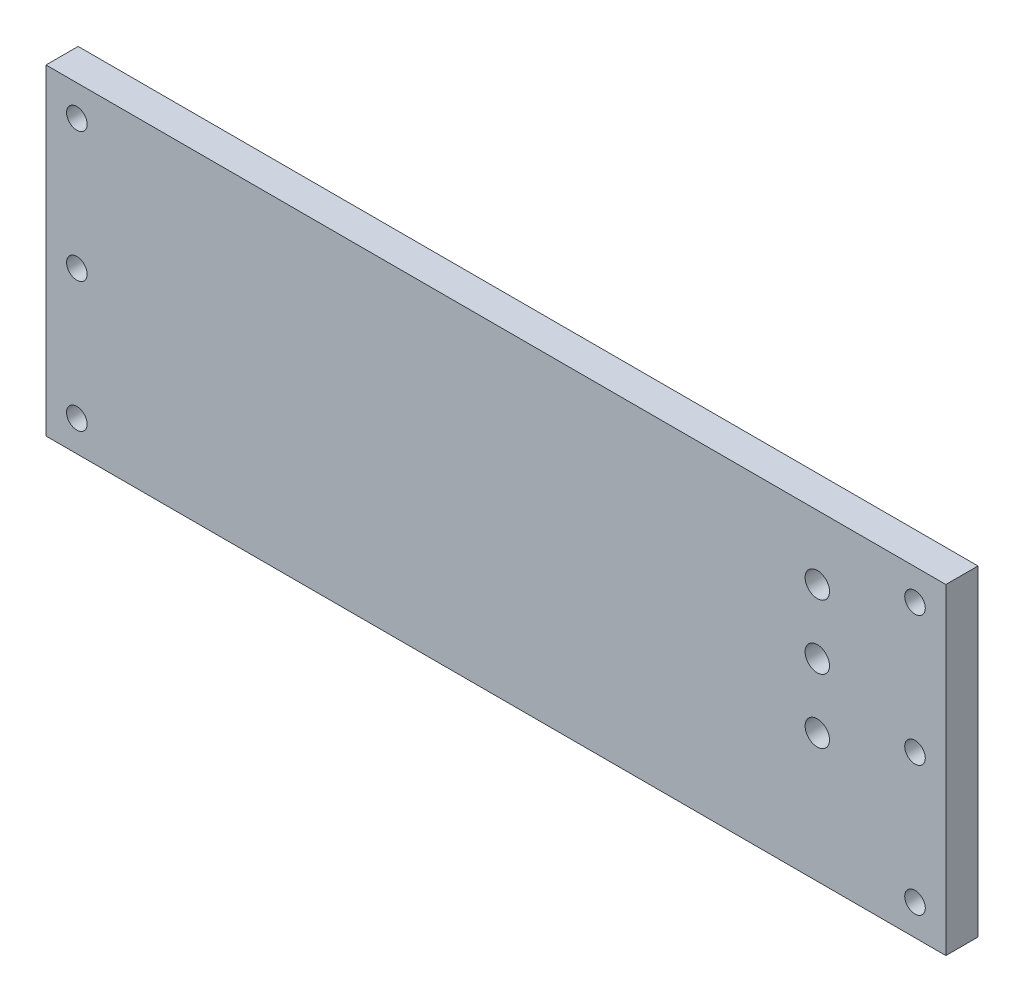
ISO-10303-21;
HEADER;
FILE_DESCRIPTION(('STEP AP214'),'2;1');
FILE_NAME('part.step','',(''),(''),'','','');
FILE_SCHEMA(('AUTOMOTIVE_DESIGN { 1 0 10303 214 1 1 1 1 }'));
ENDSEC;
DATA;
#1=APPLICATION_CONTEXT('core data for automotive mechanical design processes');
#2=APPLICATION_PROTOCOL_DEFINITION('international standard','automotive_design',2000,#1);
#3=PRODUCT_CONTEXT('',#1,'mechanical');
#4=PRODUCT('Part','Part','',(#3));
#5=PRODUCT_RELATED_PRODUCT_CATEGORY('part','',(#4));
#6=PRODUCT_DEFINITION_FORMATION('','',#4);
#7=PRODUCT_DEFINITION_CONTEXT('part definition',#1,'design');
#8=PRODUCT_DEFINITION('design','',#6,#7);
#9=PRODUCT_DEFINITION_SHAPE('','',#8);
#10=(LENGTH_UNIT() NAMED_UNIT(*) SI_UNIT(.MILLI.,.METRE.));
#11=(NAMED_UNIT(*) PLANE_ANGLE_UNIT() SI_UNIT($,.RADIAN.));
#12=(NAMED_UNIT(*) SI_UNIT($,.STERADIAN.) SOLID_ANGLE_UNIT());
#13=UNCERTAINTY_MEASURE_WITH_UNIT(LENGTH_MEASURE(1.E-05),#10,'distance_accuracy_value','');
#14=(GEOMETRIC_REPRESENTATION_CONTEXT(3) GLOBAL_UNCERTAINTY_ASSIGNED_CONTEXT((#13)) GLOBAL_UNIT_ASSIGNED_CONTEXT((#10,
#11,#12)) REPRESENTATION_CONTEXT('',''));
#15=CARTESIAN_POINT('',(0.,0.,0.));
#16=DIRECTION('',(0.,0.,1.));
#17=DIRECTION('',(1.,0.,0.));
#18=AXIS2_PLACEMENT_3D('',#15,#16,#17);
#19=CARTESIAN_POINT('',(63.5,-6.35000000000002,0.));
#20=DIRECTION('',(0.,0.,1.));
#21=DIRECTION('',(1.,0.,0.));
#22=AXIS2_PLACEMENT_3D('',#19,#20,#21);
#23=CYLINDRICAL_SURFACE('',#22,2.413);
#24=CARTESIAN_POINT('',(63.5,-6.35000000000002,0.));
#25=DIRECTION('',(0.,0.,1.));
#26=DIRECTION('',(1.,0.,0.));
#27=AXIS2_PLACEMENT_3D('',#24,#25,#26);
#28=CIRCLE('',#27,2.413);
#29=CARTESIAN_POINT('',(65.913,-6.35000000000002,0.));
#30=VERTEX_POINT('',#29);
#31=EDGE_CURVE('E49',#30,#30,#28,.T.);
#32=ORIENTED_EDGE('',*,*,#31,.F.);
#33=EDGE_LOOP('',(#32));
#34=FACE_BOUND('',#33,.T.);
#35=CARTESIAN_POINT('',(63.5,-6.35000000000002,6.35));
#36=DIRECTION('',(0.,0.,1.));
#37=DIRECTION('',(1.,0.,0.));
#38=AXIS2_PLACEMENT_3D('',#35,#36,#37);
#39=CIRCLE('',#38,2.413);
#40=CARTESIAN_POINT('',(65.913,-6.35000000000002,6.35));
#41=VERTEX_POINT('',#40);
#42=EDGE_CURVE('E12',#41,#41,#39,.T.);
#43=ORIENTED_EDGE('',*,*,#42,.T.);
#44=EDGE_LOOP('',(#43));
#45=FACE_BOUND('',#44,.T.);
#46=ADVANCED_FACE('F39',(#34,#45),#23,.F.);
#47=CARTESIAN_POINT('',(0.,-31.75,6.35));
#48=DIRECTION('',(0.,1.,0.));
#49=DIRECTION('',(0.,0.,1.));
#50=AXIS2_PLACEMENT_3D('',#47,#48,#49);
#51=PLANE('',#50);
#52=DIRECTION('',(1.,0.,0.));
#53=VECTOR('',#52,1.);
#54=CARTESIAN_POINT('',(0.,-31.75,0.));
#55=LINE('',#54,#53);
#56=CARTESIAN_POINT('',(-88.9,-31.75,0.));
#57=VERTEX_POINT('',#56);
#58=CARTESIAN_POINT('',(88.9,-31.75,0.));
#59=VERTEX_POINT('',#58);
#60=EDGE_CURVE('E147',#57,#59,#55,.T.);
#61=ORIENTED_EDGE('',*,*,#60,.T.);
#62=DIRECTION('',(0.,0.,-1.));
#63=VECTOR('',#62,1.);
#64=CARTESIAN_POINT('',(88.9,-31.75,6.35));
#65=LINE('',#64,#63);
#66=CARTESIAN_POINT('',(88.9,-31.75,6.35));
#67=VERTEX_POINT('',#66);
#68=EDGE_CURVE('E102',#67,#59,#65,.T.);
#69=ORIENTED_EDGE('',*,*,#68,.F.);
#70=DIRECTION('',(1.,0.,0.));
#71=VECTOR('',#70,1.);
#72=CARTESIAN_POINT('',(0.,-31.75,6.35));
#73=LINE('',#72,#71);
#74=CARTESIAN_POINT('',(-88.9,-31.75,6.35));
#75=VERTEX_POINT('',#74);
#76=EDGE_CURVE('E92',#75,#67,#73,.T.);
#77=ORIENTED_EDGE('',*,*,#76,.F.);
#78=DIRECTION('',(0.,0.,-1.));
#79=VECTOR('',#78,1.);
#80=CARTESIAN_POINT('',(-88.9,-31.75,6.35));
#81=LINE('',#80,#79);
#82=EDGE_CURVE('E57',#75,#57,#81,.T.);
#83=ORIENTED_EDGE('',*,*,#82,.T.);
#84=EDGE_LOOP('',(#61,#69,#77,#83));
#85=FACE_BOUND('',#84,.T.);
#86=ADVANCED_FACE('F181',(#85),#51,.F.);
#87=CARTESIAN_POINT('',(88.9,0.,6.35));
#88=DIRECTION('',(-1.,0.,0.));
#89=DIRECTION('',(0.,0.,1.));
#90=AXIS2_PLACEMENT_3D('',#87,#88,#89);
#91=PLANE('',#90);
#92=DIRECTION('',(0.,1.,0.));
#93=VECTOR('',#92,1.);
#94=CARTESIAN_POINT('',(88.9,0.,0.));
#95=LINE('',#94,#93);
#96=CARTESIAN_POINT('',(88.9,31.75,0.));
#97=VERTEX_POINT('',#96);
#98=EDGE_CURVE('E99',#59,#97,#95,.T.);
#99=ORIENTED_EDGE('',*,*,#98,.T.);
#100=DIRECTION('',(0.,0.,-1.));
#101=VECTOR('',#100,1.);
#102=CARTESIAN_POINT('',(88.9,31.75,6.35));
#103=LINE('',#102,#101);
#104=CARTESIAN_POINT('',(88.9,31.75,6.35));
#105=VERTEX_POINT('',#104);
#106=EDGE_CURVE('E97',#105,#97,#103,.T.);
#107=ORIENTED_EDGE('',*,*,#106,.F.);
#108=DIRECTION('',(0.,1.,0.));
#109=VECTOR('',#108,1.);
#110=CARTESIAN_POINT('',(88.9,0.,6.35));
#111=LINE('',#110,#109);
#112=EDGE_CURVE('E83',#67,#105,#111,.T.);
#113=ORIENTED_EDGE('',*,*,#112,.F.);
#114=ORIENTED_EDGE('',*,*,#68,.T.);
#115=EDGE_LOOP('',(#99,#107,#113,#114));
#116=FACE_BOUND('',#115,.T.);
#117=ADVANCED_FACE('F98',(#116),#91,.F.);
#118=CARTESIAN_POINT('',(0.,31.75,6.35));
#119=DIRECTION('',(0.,1.,0.));
#120=DIRECTION('',(0.,0.,1.));
#121=AXIS2_PLACEMENT_3D('',#118,#119,#120);
#122=PLANE('',#121);
#123=DIRECTION('',(1.,0.,0.));
#124=VECTOR('',#123,1.);
#125=CARTESIAN_POINT('',(0.,31.75,0.));
#126=LINE('',#125,#124);
#127=CARTESIAN_POINT('',(-88.9,31.75,0.));
#128=VERTEX_POINT('',#127);
#129=EDGE_CURVE('E151',#128,#97,#126,.T.);
#130=ORIENTED_EDGE('',*,*,#129,.F.);
#131=DIRECTION('',(0.,0.,-1.));
#132=VECTOR('',#131,1.);
#133=CARTESIAN_POINT('',(-88.9,31.75,6.35));
#134=LINE('',#133,#132);
#135=CARTESIAN_POINT('',(-88.9,31.75,6.35));
#136=VERTEX_POINT('',#135);
#137=EDGE_CURVE('E71',#136,#128,#134,.T.);
#138=ORIENTED_EDGE('',*,*,#137,.F.);
#139=DIRECTION('',(1.,0.,0.));
#140=VECTOR('',#139,1.);
#141=CARTESIAN_POINT('',(0.,31.75,6.35));
#142=LINE('',#141,#140);
#143=EDGE_CURVE('E91',#136,#105,#142,.T.);
#144=ORIENTED_EDGE('',*,*,#143,.T.);
#145=ORIENTED_EDGE('',*,*,#106,.T.);
#146=EDGE_LOOP('',(#130,#138,#144,#145));
#147=FACE_BOUND('',#146,.T.);
#148=ADVANCED_FACE('F104',(#147),#122,.T.);
#149=CARTESIAN_POINT('',(82.8039999999995,-25.654,6.35));
#150=DIRECTION('',(0.,0.,-1.));
#151=DIRECTION('',(-1.,0.,0.));
#152=AXIS2_PLACEMENT_3D('',#149,#150,#151);
#153=CYLINDRICAL_SURFACE('',#152,2.03200000000001);
#154=CARTESIAN_POINT('',(82.8039999999995,-25.654,6.35));
#155=DIRECTION('',(0.,0.,1.));
#156=DIRECTION('',(1.,0.,0.));
#157=AXIS2_PLACEMENT_3D('',#154,#155,#156);
#158=CIRCLE('',#157,2.03200000000001);
#159=CARTESIAN_POINT('',(84.8359999999995,-25.654,6.35));
#160=VERTEX_POINT('',#159);
#161=EDGE_CURVE('E136',#160,#160,#158,.F.);
#162=ORIENTED_EDGE('',*,*,#161,.F.);
#163=EDGE_LOOP('',(#162));
#164=FACE_BOUND('',#163,.T.);
#165=CARTESIAN_POINT('',(82.8039999999995,-25.654,0.));
#166=DIRECTION('',(0.,0.,1.));
#167=DIRECTION('',(1.,0.,0.));
#168=AXIS2_PLACEMENT_3D('',#165,#166,#167);
#169=CIRCLE('',#168,2.03200000000001);
#170=CARTESIAN_POINT('',(84.8359999999995,-25.654,0.));
#171=VERTEX_POINT('',#170);
#172=EDGE_CURVE('E165',#171,#171,#169,.F.);
#173=ORIENTED_EDGE('',*,*,#172,.T.);
#174=EDGE_LOOP('',(#173));
#175=FACE_BOUND('',#174,.T.);
#176=ADVANCED_FACE('F203',(#164,#175),#153,.F.);
#177=CARTESIAN_POINT('',(-82.8039999999995,-25.654,6.35));
#178=DIRECTION('',(0.,0.,-1.));
#179=DIRECTION('',(-1.,0.,0.));
#180=AXIS2_PLACEMENT_3D('',#177,#178,#179);
#181=CYLINDRICAL_SURFACE('',#180,2.03200000000001);
#182=CARTESIAN_POINT('',(-82.8039999999995,-25.654,6.35));
#183=DIRECTION('',(0.,0.,1.));
#184=DIRECTION('',(1.,0.,0.));
#185=AXIS2_PLACEMENT_3D('',#182,#183,#184);
#186=CIRCLE('',#185,2.03200000000001);
#187=CARTESIAN_POINT('',(-80.7719999999995,-25.654,6.35));
#188=VERTEX_POINT('',#187);
#189=EDGE_CURVE('E131',#188,#188,#186,.T.);
#190=ORIENTED_EDGE('',*,*,#189,.T.);
#191=EDGE_LOOP('',(#190));
#192=FACE_BOUND('',#191,.T.);
#193=CARTESIAN_POINT('',(-82.8039999999995,-25.654,0.));
#194=DIRECTION('',(0.,0.,1.));
#195=DIRECTION('',(1.,0.,0.));
#196=AXIS2_PLACEMENT_3D('',#193,#194,#195);
#197=CIRCLE('',#196,2.03200000000001);
#198=CARTESIAN_POINT('',(-80.7719999999995,-25.654,0.));
#199=VERTEX_POINT('',#198);
#200=EDGE_CURVE('E162',#199,#199,#197,.T.);
#201=ORIENTED_EDGE('',*,*,#200,.F.);
#202=EDGE_LOOP('',(#201));
#203=FACE_BOUND('',#202,.T.);
#204=ADVANCED_FACE('F206',(#192,#203),#181,.F.);
#205=CARTESIAN_POINT('',(-82.8039999999997,0.,6.35));
#206=DIRECTION('',(0.,0.,-1.));
#207=DIRECTION('',(-1.,0.,0.));
#208=AXIS2_PLACEMENT_3D('',#205,#206,#207);
#209=CYLINDRICAL_SURFACE('',#208,2.03200000000001);
#210=CARTESIAN_POINT('',(-82.8039999999997,0.,6.35));
#211=DIRECTION('',(0.,0.,1.));
#212=DIRECTION('',(1.,0.,0.));
#213=AXIS2_PLACEMENT_3D('',#210,#211,#212);
#214=CIRCLE('',#213,2.03200000000001);
#215=CARTESIAN_POINT('',(-80.7719999999997,0.,6.35));
#216=VERTEX_POINT('',#215);
#217=EDGE_CURVE('E126',#216,#216,#214,.T.);
#218=ORIENTED_EDGE('',*,*,#217,.T.);
#219=EDGE_LOOP('',(#218));
#220=FACE_BOUND('',#219,.T.);
#221=CARTESIAN_POINT('',(-82.8039999999997,0.,0.));
#222=DIRECTION('',(0.,0.,1.));
#223=DIRECTION('',(1.,0.,0.));
#224=AXIS2_PLACEMENT_3D('',#221,#222,#223);
#225=CIRCLE('',#224,2.03200000000001);
#226=CARTESIAN_POINT('',(-80.7719999999997,0.,0.));
#227=VERTEX_POINT('',#226);
#228=EDGE_CURVE('E159',#227,#227,#225,.T.);
#229=ORIENTED_EDGE('',*,*,#228,.F.);
#230=EDGE_LOOP('',(#229));
#231=FACE_BOUND('',#230,.T.);
#232=ADVANCED_FACE('F210',(#220,#231),#209,.F.);
#233=CARTESIAN_POINT('',(-82.804,25.654,6.35));
#234=DIRECTION('',(0.,0.,-1.));
#235=DIRECTION('',(-1.,0.,0.));
#236=AXIS2_PLACEMENT_3D('',#233,#234,#235);
#237=CYLINDRICAL_SURFACE('',#236,2.03200000000001);
#238=CARTESIAN_POINT('',(-82.804,25.654,6.35));
#239=DIRECTION('',(0.,0.,1.));
#240=DIRECTION('',(1.,0.,0.));
#241=AXIS2_PLACEMENT_3D('',#238,#239,#240);
#242=CIRCLE('',#241,2.03200000000001);
#243=CARTESIAN_POINT('',(-80.772,25.654,6.35));
#244=VERTEX_POINT('',#243);
#245=EDGE_CURVE('E109',#244,#244,#242,.T.);
#246=ORIENTED_EDGE('',*,*,#245,.T.);
#247=EDGE_LOOP('',(#246));
#248=FACE_BOUND('',#247,.T.);
#249=CARTESIAN_POINT('',(-82.804,25.654,0.));
#250=DIRECTION('',(0.,0.,1.));
#251=DIRECTION('',(1.,0.,0.));
#252=AXIS2_PLACEMENT_3D('',#249,#250,#251);
#253=CIRCLE('',#252,2.03200000000001);
#254=CARTESIAN_POINT('',(-80.772,25.654,0.));
#255=VERTEX_POINT('',#254);
#256=EDGE_CURVE('E156',#255,#255,#253,.T.);
#257=ORIENTED_EDGE('',*,*,#256,.F.);
#258=EDGE_LOOP('',(#257));
#259=FACE_BOUND('',#258,.T.);
#260=ADVANCED_FACE('F214',(#248,#259),#237,.F.);
#261=CARTESIAN_POINT('',(-88.9,0.,6.35));
#262=DIRECTION('',(-1.,0.,0.));
#263=DIRECTION('',(0.,0.,1.));
#264=AXIS2_PLACEMENT_3D('',#261,#262,#263);
#265=PLANE('',#264);
#266=DIRECTION('',(0.,1.,0.));
#267=VECTOR('',#266,1.);
#268=CARTESIAN_POINT('',(-88.9,0.,0.));
#269=LINE('',#268,#267);
#270=EDGE_CURVE('E153',#57,#128,#269,.T.);
#271=ORIENTED_EDGE('',*,*,#270,.F.);
#272=ORIENTED_EDGE('',*,*,#82,.F.);
#273=DIRECTION('',(0.,1.,0.));
#274=VECTOR('',#273,1.);
#275=CARTESIAN_POINT('',(-88.9,0.,6.35));
#276=LINE('',#275,#274);
#277=EDGE_CURVE('E106',#75,#136,#276,.T.);
#278=ORIENTED_EDGE('',*,*,#277,.T.);
#279=ORIENTED_EDGE('',*,*,#137,.T.);
#280=EDGE_LOOP('',(#271,#272,#278,#279));
#281=FACE_BOUND('',#280,.T.);
#282=ADVANCED_FACE('F218',(#281),#265,.T.);
#283=CARTESIAN_POINT('',(82.8039999999997,0.,6.35));
#284=DIRECTION('',(0.,0.,-1.));
#285=DIRECTION('',(-1.,0.,0.));
#286=AXIS2_PLACEMENT_3D('',#283,#284,#285);
#287=CYLINDRICAL_SURFACE('',#286,2.03200000000001);
#288=CARTESIAN_POINT('',(82.8039999999997,0.,6.35));
#289=DIRECTION('',(0.,0.,1.));
#290=DIRECTION('',(1.,0.,0.));
#291=AXIS2_PLACEMENT_3D('',#288,#289,#290);
#292=CIRCLE('',#291,2.03200000000001);
#293=CARTESIAN_POINT('',(84.8359999999997,0.,6.35));
#294=VERTEX_POINT('',#293);
#295=EDGE_CURVE('E171',#294,#294,#292,.F.);
#296=ORIENTED_EDGE('',*,*,#295,.F.);
#297=EDGE_LOOP('',(#296));
#298=FACE_BOUND('',#297,.T.);
#299=CARTESIAN_POINT('',(82.8039999999997,0.,0.));
#300=DIRECTION('',(0.,0.,1.));
#301=DIRECTION('',(1.,0.,0.));
#302=AXIS2_PLACEMENT_3D('',#299,#300,#301);
#303=CIRCLE('',#302,2.03200000000001);
#304=CARTESIAN_POINT('',(84.8359999999997,0.,0.));
#305=VERTEX_POINT('',#304);
#306=EDGE_CURVE('E144',#305,#305,#303,.F.);
#307=ORIENTED_EDGE('',*,*,#306,.T.);
#308=EDGE_LOOP('',(#307));
#309=FACE_BOUND('',#308,.T.);
#310=ADVANCED_FACE('F195',(#298,#309),#287,.F.);
#311=CARTESIAN_POINT('',(82.804,25.654,6.35));
#312=DIRECTION('',(0.,0.,-1.));
#313=DIRECTION('',(-1.,0.,0.));
#314=AXIS2_PLACEMENT_3D('',#311,#312,#313);
#315=CYLINDRICAL_SURFACE('',#314,2.03200000000001);
#316=CARTESIAN_POINT('',(82.804,25.654,6.35));
#317=DIRECTION('',(0.,0.,1.));
#318=DIRECTION('',(1.,0.,0.));
#319=AXIS2_PLACEMENT_3D('',#316,#317,#318);
#320=CIRCLE('',#319,2.03200000000001);
#321=CARTESIAN_POINT('',(84.836,25.654,6.35));
#322=VERTEX_POINT('',#321);
#323=EDGE_CURVE('E140',#322,#322,#320,.F.);
#324=ORIENTED_EDGE('',*,*,#323,.F.);
#325=EDGE_LOOP('',(#324));
#326=FACE_BOUND('',#325,.T.);
#327=CARTESIAN_POINT('',(82.804,25.654,0.));
#328=DIRECTION('',(0.,0.,1.));
#329=DIRECTION('',(1.,0.,0.));
#330=AXIS2_PLACEMENT_3D('',#327,#328,#329);
#331=CIRCLE('',#330,2.03200000000001);
#332=CARTESIAN_POINT('',(84.836,25.654,0.));
#333=VERTEX_POINT('',#332);
#334=EDGE_CURVE('E168',#333,#333,#331,.F.);
#335=ORIENTED_EDGE('',*,*,#334,.T.);
#336=EDGE_LOOP('',(#335));
#337=FACE_BOUND('',#336,.T.);
#338=ADVANCED_FACE('F185',(#326,#337),#315,.F.);
#339=CARTESIAN_POINT('',(0.,0.,6.35));
#340=DIRECTION('',(0.,0.,1.));
#341=DIRECTION('',(1.,0.,0.));
#342=AXIS2_PLACEMENT_3D('',#339,#340,#341);
#343=PLANE('',#342);
#344=CARTESIAN_POINT('',(63.5,6.34999999999998,6.35));
#345=DIRECTION('',(0.,0.,1.));
#346=DIRECTION('',(1.,0.,0.));
#347=AXIS2_PLACEMENT_3D('',#344,#345,#346);
#348=CIRCLE('',#347,2.413);
#349=CARTESIAN_POINT('',(65.913,6.34999999999998,6.35));
#350=VERTEX_POINT('',#349);
#351=EDGE_CURVE('E265',#350,#350,#348,.T.);
#352=ORIENTED_EDGE('',*,*,#351,.F.);
#353=EDGE_LOOP('',(#352));
#354=FACE_BOUND('',#353,.T.);
#355=CARTESIAN_POINT('',(63.5,19.05,6.35));
#356=DIRECTION('',(0.,0.,1.));
#357=DIRECTION('',(1.,0.,0.));
#358=AXIS2_PLACEMENT_3D('',#355,#356,#357);
#359=CIRCLE('',#358,2.413);
#360=CARTESIAN_POINT('',(65.913,19.05,6.35));
#361=VERTEX_POINT('',#360);
#362=EDGE_CURVE('E260',#361,#361,#359,.T.);
#363=ORIENTED_EDGE('',*,*,#362,.F.);
#364=EDGE_LOOP('',(#363));
#365=FACE_BOUND('',#364,.T.);
#366=ORIENTED_EDGE('',*,*,#295,.T.);
#367=EDGE_LOOP('',(#366));
#368=FACE_BOUND('',#367,.T.);
#369=ORIENTED_EDGE('',*,*,#76,.T.);
#370=ORIENTED_EDGE('',*,*,#112,.T.);
#371=ORIENTED_EDGE('',*,*,#143,.F.);
#372=ORIENTED_EDGE('',*,*,#277,.F.);
#373=EDGE_LOOP('',(#369,#370,#371,#372));
#374=FACE_BOUND('',#373,.T.);
#375=ORIENTED_EDGE('',*,*,#245,.F.);
#376=EDGE_LOOP('',(#375));
#377=FACE_BOUND('',#376,.T.);
#378=ORIENTED_EDGE('',*,*,#217,.F.);
#379=EDGE_LOOP('',(#378));
#380=FACE_BOUND('',#379,.T.);
#381=ORIENTED_EDGE('',*,*,#189,.F.);
#382=EDGE_LOOP('',(#381));
#383=FACE_BOUND('',#382,.T.);
#384=ORIENTED_EDGE('',*,*,#161,.T.);
#385=EDGE_LOOP('',(#384));
#386=FACE_BOUND('',#385,.T.);
#387=ORIENTED_EDGE('',*,*,#323,.T.);
#388=EDGE_LOOP('',(#387));
#389=FACE_BOUND('',#388,.T.);
#390=ORIENTED_EDGE('',*,*,#42,.F.);
#391=EDGE_LOOP('',(#390));
#392=FACE_BOUND('',#391,.T.);
#393=ADVANCED_FACE('F87',(#354,#365,#368,#374,#377,#380,#383,#386,#389,#392),#343,.T.);
#394=CARTESIAN_POINT('',(0.,0.,0.));
#395=DIRECTION('',(0.,0.,1.));
#396=DIRECTION('',(1.,0.,0.));
#397=AXIS2_PLACEMENT_3D('',#394,#395,#396);
#398=PLANE('',#397);
#399=CARTESIAN_POINT('',(63.5,6.34999999999998,0.));
#400=DIRECTION('',(0.,0.,1.));
#401=DIRECTION('',(1.,0.,0.));
#402=AXIS2_PLACEMENT_3D('',#399,#400,#401);
#403=CIRCLE('',#402,2.413);
#404=CARTESIAN_POINT('',(65.913,6.34999999999998,0.));
#405=VERTEX_POINT('',#404);
#406=EDGE_CURVE('E271',#405,#405,#403,.T.);
#407=ORIENTED_EDGE('',*,*,#406,.T.);
#408=EDGE_LOOP('',(#407));
#409=FACE_BOUND('',#408,.T.);
#410=CARTESIAN_POINT('',(63.5,19.05,0.));
#411=DIRECTION('',(0.,0.,1.));
#412=DIRECTION('',(1.,0.,0.));
#413=AXIS2_PLACEMENT_3D('',#410,#411,#412);
#414=CIRCLE('',#413,2.413);
#415=CARTESIAN_POINT('',(65.913,19.05,0.));
#416=VERTEX_POINT('',#415);
#417=EDGE_CURVE('E148',#416,#416,#414,.T.);
#418=ORIENTED_EDGE('',*,*,#417,.T.);
#419=EDGE_LOOP('',(#418));
#420=FACE_BOUND('',#419,.T.);
#421=ORIENTED_EDGE('',*,*,#306,.F.);
#422=EDGE_LOOP('',(#421));
#423=FACE_BOUND('',#422,.T.);
#424=ORIENTED_EDGE('',*,*,#60,.F.);
#425=ORIENTED_EDGE('',*,*,#270,.T.);
#426=ORIENTED_EDGE('',*,*,#129,.T.);
#427=ORIENTED_EDGE('',*,*,#98,.F.);
#428=EDGE_LOOP('',(#424,#425,#426,#427));
#429=FACE_BOUND('',#428,.T.);
#430=ORIENTED_EDGE('',*,*,#256,.T.);
#431=EDGE_LOOP('',(#430));
#432=FACE_BOUND('',#431,.T.);
#433=ORIENTED_EDGE('',*,*,#228,.T.);
#434=EDGE_LOOP('',(#433));
#435=FACE_BOUND('',#434,.T.);
#436=ORIENTED_EDGE('',*,*,#200,.T.);
#437=EDGE_LOOP('',(#436));
#438=FACE_BOUND('',#437,.T.);
#439=ORIENTED_EDGE('',*,*,#172,.F.);
#440=EDGE_LOOP('',(#439));
#441=FACE_BOUND('',#440,.T.);
#442=ORIENTED_EDGE('',*,*,#334,.F.);
#443=EDGE_LOOP('',(#442));
#444=FACE_BOUND('',#443,.T.);
#445=ORIENTED_EDGE('',*,*,#31,.T.);
#446=EDGE_LOOP('',(#445));
#447=FACE_BOUND('',#446,.T.);
#448=ADVANCED_FACE('F177',(#409,#420,#423,#429,#432,#435,#438,#441,#444,#447),#398,.F.);
#449=CARTESIAN_POINT('',(63.5,19.05,0.));
#450=DIRECTION('',(0.,0.,1.));
#451=DIRECTION('',(1.,0.,0.));
#452=AXIS2_PLACEMENT_3D('',#449,#450,#451);
#453=CYLINDRICAL_SURFACE('',#452,2.413);
#454=ORIENTED_EDGE('',*,*,#417,.F.);
#455=EDGE_LOOP('',(#454));
#456=FACE_BOUND('',#455,.T.);
#457=ORIENTED_EDGE('',*,*,#362,.T.);
#458=EDGE_LOOP('',(#457));
#459=FACE_BOUND('',#458,.T.);
#460=ADVANCED_FACE('F192',(#456,#459),#453,.F.);
#461=CARTESIAN_POINT('',(63.5,6.34999999999998,0.));
#462=DIRECTION('',(0.,0.,1.));
#463=DIRECTION('',(1.,0.,0.));
#464=AXIS2_PLACEMENT_3D('',#461,#462,#463);
#465=CYLINDRICAL_SURFACE('',#464,2.413);
#466=ORIENTED_EDGE('',*,*,#406,.F.);
#467=EDGE_LOOP('',(#466));
#468=FACE_BOUND('',#467,.T.);
#469=ORIENTED_EDGE('',*,*,#351,.T.);
#470=EDGE_LOOP('',(#469));
#471=FACE_BOUND('',#470,.T.);
#472=ADVANCED_FACE('F276',(#468,#471),#465,.F.);
#473=CLOSED_SHELL('',(#46,#86,#117,#148,#176,#204,#232,#260,#282,#310,#338,#393,#448,#460,#472));
#474=MANIFOLD_SOLID_BREP('B2',#473);
#475=ADVANCED_BREP_SHAPE_REPRESENTATION('',(#18,#474),#14);
#476=SHAPE_DEFINITION_REPRESENTATION(#9,#475);
ENDSEC;
END-ISO-10303-21;
